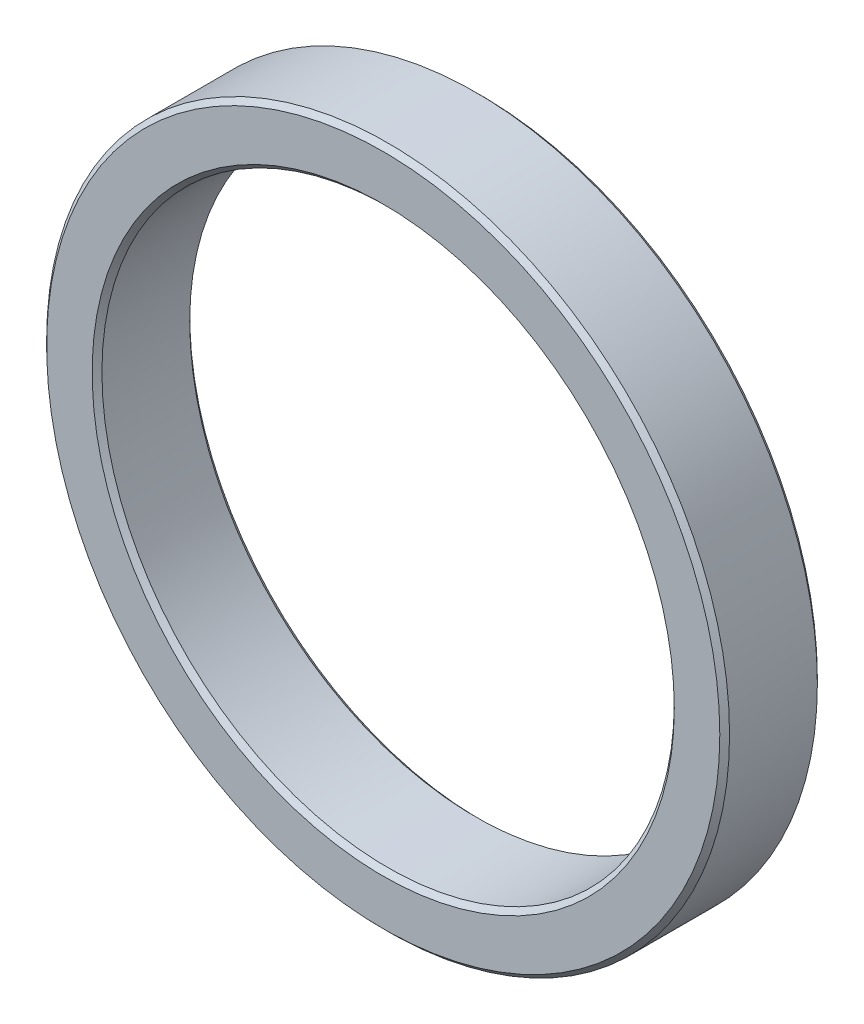
ISO-10303-21;
HEADER;
FILE_DESCRIPTION(('STEP AP214'),'2;1');
FILE_NAME('part.step','',(''),(''),'','','');
FILE_SCHEMA(('AUTOMOTIVE_DESIGN { 1 0 10303 214 1 1 1 1 }'));
ENDSEC;
DATA;
#1=APPLICATION_CONTEXT('core data for automotive mechanical design processes');
#2=APPLICATION_PROTOCOL_DEFINITION('international standard','automotive_design',2000,#1);
#3=PRODUCT_CONTEXT('',#1,'mechanical');
#4=PRODUCT('Part','Part','',(#3));
#5=PRODUCT_RELATED_PRODUCT_CATEGORY('part','',(#4));
#6=PRODUCT_DEFINITION_FORMATION('','',#4);
#7=PRODUCT_DEFINITION_CONTEXT('part definition',#1,'design');
#8=PRODUCT_DEFINITION('design','',#6,#7);
#9=PRODUCT_DEFINITION_SHAPE('','',#8);
#10=(LENGTH_UNIT() NAMED_UNIT(*) SI_UNIT(.MILLI.,.METRE.));
#11=(NAMED_UNIT(*) PLANE_ANGLE_UNIT() SI_UNIT($,.RADIAN.));
#12=(NAMED_UNIT(*) SI_UNIT($,.STERADIAN.) SOLID_ANGLE_UNIT());
#13=UNCERTAINTY_MEASURE_WITH_UNIT(LENGTH_MEASURE(1.E-05),#10,'distance_accuracy_value','');
#14=(GEOMETRIC_REPRESENTATION_CONTEXT(3) GLOBAL_UNCERTAINTY_ASSIGNED_CONTEXT((#13)) GLOBAL_UNIT_ASSIGNED_CONTEXT((#10,
#11,#12)) REPRESENTATION_CONTEXT('',''));
#15=CARTESIAN_POINT('',(0.,0.,0.));
#16=DIRECTION('',(0.,0.,1.));
#17=DIRECTION('',(1.,0.,0.));
#18=AXIS2_PLACEMENT_3D('',#15,#16,#17);
#19=CARTESIAN_POINT('',(0.,0.,6.));
#20=DIRECTION('',(0.,0.,1.));
#21=DIRECTION('',(1.,0.,0.));
#22=AXIS2_PLACEMENT_3D('',#19,#20,#21);
#23=PLANE('',#22);
#24=CARTESIAN_POINT('',(0.,0.,6.));
#25=DIRECTION('',(0.,0.,1.));
#26=DIRECTION('',(1.,0.,0.));
#27=AXIS2_PLACEMENT_3D('',#24,#25,#26);
#28=CIRCLE('',#27,20.7);
#29=CARTESIAN_POINT('',(20.7,0.,6.));
#30=VERTEX_POINT('',#29);
#31=EDGE_CURVE('E39',#30,#30,#28,.T.);
#32=ORIENTED_EDGE('',*,*,#31,.T.);
#33=EDGE_LOOP('',(#32));
#34=FACE_BOUND('',#33,.T.);
#35=CARTESIAN_POINT('',(0.,0.,6.));
#36=DIRECTION('',(0.,0.,1.));
#37=DIRECTION('',(1.,0.,0.));
#38=AXIS2_PLACEMENT_3D('',#35,#36,#37);
#39=CIRCLE('',#38,17.9);
#40=CARTESIAN_POINT('',(17.9,0.,6.));
#41=VERTEX_POINT('',#40);
#42=EDGE_CURVE('E43',#41,#41,#39,.F.);
#43=ORIENTED_EDGE('',*,*,#42,.T.);
#44=EDGE_LOOP('',(#43));
#45=FACE_BOUND('',#44,.T.);
#46=ADVANCED_FACE('F28',(#34,#45),#23,.T.);
#47=CARTESIAN_POINT('',(0.,0.,0.));
#48=DIRECTION('',(0.,0.,1.));
#49=DIRECTION('',(1.,0.,0.));
#50=AXIS2_PLACEMENT_3D('',#47,#48,#49);
#51=PLANE('',#50);
#52=CARTESIAN_POINT('',(0.,0.,0.));
#53=DIRECTION('',(0.,0.,1.));
#54=DIRECTION('',(1.,0.,0.));
#55=AXIS2_PLACEMENT_3D('',#52,#53,#54);
#56=CIRCLE('',#55,20.7);
#57=CARTESIAN_POINT('',(20.7,0.,0.));
#58=VERTEX_POINT('',#57);
#59=EDGE_CURVE('E48',#58,#58,#56,.F.);
#60=ORIENTED_EDGE('',*,*,#59,.T.);
#61=EDGE_LOOP('',(#60));
#62=FACE_BOUND('',#61,.T.);
#63=CARTESIAN_POINT('',(0.,0.,0.));
#64=DIRECTION('',(0.,0.,1.));
#65=DIRECTION('',(1.,0.,0.));
#66=AXIS2_PLACEMENT_3D('',#63,#64,#65);
#67=CIRCLE('',#66,17.9);
#68=CARTESIAN_POINT('',(17.9,0.,0.));
#69=VERTEX_POINT('',#68);
#70=EDGE_CURVE('E51',#69,#69,#67,.T.);
#71=ORIENTED_EDGE('',*,*,#70,.T.);
#72=EDGE_LOOP('',(#71));
#73=FACE_BOUND('',#72,.T.);
#74=ADVANCED_FACE('F73',(#62,#73),#51,.F.);
#75=CARTESIAN_POINT('',(0.,0.,6.));
#76=DIRECTION('',(0.,0.,-1.));
#77=DIRECTION('',(-1.,0.,0.));
#78=AXIS2_PLACEMENT_3D('',#75,#76,#77);
#79=CYLINDRICAL_SURFACE('',#78,21.);
#80=CARTESIAN_POINT('',(0.,0.,0.300000000000005));
#81=DIRECTION('',(0.,0.,1.));
#82=DIRECTION('',(1.,0.,0.));
#83=AXIS2_PLACEMENT_3D('',#80,#81,#82);
#84=CIRCLE('',#83,21.);
#85=CARTESIAN_POINT('',(21.,0.,0.300000000000005));
#86=VERTEX_POINT('',#85);
#87=EDGE_CURVE('E54',#86,#86,#84,.T.);
#88=ORIENTED_EDGE('',*,*,#87,.T.);
#89=EDGE_LOOP('',(#88));
#90=FACE_BOUND('',#89,.T.);
#91=CARTESIAN_POINT('',(0.,0.,5.70000000000001));
#92=DIRECTION('',(0.,0.,1.));
#93=DIRECTION('',(1.,0.,0.));
#94=AXIS2_PLACEMENT_3D('',#91,#92,#93);
#95=CIRCLE('',#94,21.);
#96=CARTESIAN_POINT('',(21.,0.,5.70000000000001));
#97=VERTEX_POINT('',#96);
#98=EDGE_CURVE('E57',#97,#97,#95,.F.);
#99=ORIENTED_EDGE('',*,*,#98,.T.);
#100=EDGE_LOOP('',(#99));
#101=FACE_BOUND('',#100,.T.);
#102=ADVANCED_FACE('F61',(#90,#101),#79,.T.);
#103=CARTESIAN_POINT('',(0.,0.,6.));
#104=DIRECTION('',(0.,0.,-1.));
#105=DIRECTION('',(-1.,0.,0.));
#106=AXIS2_PLACEMENT_3D('',#103,#104,#105);
#107=CYLINDRICAL_SURFACE('',#106,17.6);
#108=CARTESIAN_POINT('',(0.,0.,0.299999999999995));
#109=DIRECTION('',(0.,0.,1.));
#110=DIRECTION('',(1.,0.,0.));
#111=AXIS2_PLACEMENT_3D('',#108,#109,#110);
#112=CIRCLE('',#111,17.6);
#113=CARTESIAN_POINT('',(17.6,0.,0.299999999999995));
#114=VERTEX_POINT('',#113);
#115=EDGE_CURVE('E10',#114,#114,#112,.F.);
#116=ORIENTED_EDGE('',*,*,#115,.T.);
#117=EDGE_LOOP('',(#116));
#118=FACE_BOUND('',#117,.T.);
#119=CARTESIAN_POINT('',(0.,0.,5.7));
#120=DIRECTION('',(0.,0.,1.));
#121=DIRECTION('',(1.,0.,0.));
#122=AXIS2_PLACEMENT_3D('',#119,#120,#121);
#123=CIRCLE('',#122,17.6);
#124=CARTESIAN_POINT('',(17.6,0.,5.7));
#125=VERTEX_POINT('',#124);
#126=EDGE_CURVE('E35',#125,#125,#123,.T.);
#127=ORIENTED_EDGE('',*,*,#126,.T.);
#128=EDGE_LOOP('',(#127));
#129=FACE_BOUND('',#128,.T.);
#130=ADVANCED_FACE('F89',(#118,#129),#107,.F.);
#131=CARTESIAN_POINT('',(0.,0.,0.300000000000005));
#132=DIRECTION('',(0.,0.,1.));
#133=DIRECTION('',(1.,0.,0.));
#134=AXIS2_PLACEMENT_3D('',#131,#132,#133);
#135=CONICAL_SURFACE('',#134,21.,0.785398163397454);
#136=CARTESIAN_POINT('',(20.7,0.,0.));
#137=CARTESIAN_POINT('',(20.703125,0.,0.00312500000000081));
#138=CARTESIAN_POINT('',(20.70625,0.,0.0062500000000006));
#139=CARTESIAN_POINT('',(20.7125,0.,0.0125000000000002));
#140=CARTESIAN_POINT('',(20.715625,0.,0.015625));
#141=CARTESIAN_POINT('',(20.721875,0.,0.021875));
#142=CARTESIAN_POINT('',(20.725,0.,0.0250000000000002));
#143=CARTESIAN_POINT('',(20.73125,0.,0.0312500000000007));
#144=CARTESIAN_POINT('',(20.734375,0.,0.034375000000001));
#145=CARTESIAN_POINT('',(20.740625,0.,0.0406250000000008));
#146=CARTESIAN_POINT('',(20.74375,0.,0.0437500000000004));
#147=CARTESIAN_POINT('',(20.75,0.,0.0500000000000005));
#148=CARTESIAN_POINT('',(20.753125,0.,0.0531250000000011));
#149=CARTESIAN_POINT('',(20.759375,0.,0.0593750000000013));
#150=CARTESIAN_POINT('',(20.7625,0.,0.0625000000000009));
#151=CARTESIAN_POINT('',(20.76875,0.,0.0687500000000007));
#152=CARTESIAN_POINT('',(20.771875,0.,0.071875000000001));
#153=CARTESIAN_POINT('',(20.778125,0.,0.0781250000000015));
#154=CARTESIAN_POINT('',(20.78125,0.,0.0812500000000017));
#155=CARTESIAN_POINT('',(20.7875,0.,0.0875000000000016));
#156=CARTESIAN_POINT('',(20.790625,0.,0.0906250000000013));
#157=CARTESIAN_POINT('',(20.796875,0.,0.0968750000000012));
#158=CARTESIAN_POINT('',(20.8,0.,0.100000000000001));
#159=CARTESIAN_POINT('',(20.80625,0.,0.106250000000002));
#160=CARTESIAN_POINT('',(20.809375,0.,0.109375000000002));
#161=CARTESIAN_POINT('',(20.815625,0.,0.115625000000002));
#162=CARTESIAN_POINT('',(20.81875,0.,0.118750000000002));
#163=CARTESIAN_POINT('',(20.825,0.,0.125000000000002));
#164=CARTESIAN_POINT('',(20.828125,0.,0.128125000000002));
#165=CARTESIAN_POINT('',(20.834375,0.,0.134375000000003));
#166=CARTESIAN_POINT('',(20.8375,0.,0.137500000000002));
#167=CARTESIAN_POINT('',(20.84375,0.,0.143750000000002));
#168=CARTESIAN_POINT('',(20.846875,0.,0.146875000000002));
#169=CARTESIAN_POINT('',(20.853125,0.,0.153125000000003));
#170=CARTESIAN_POINT('',(20.85625,0.,0.156250000000003));
#171=CARTESIAN_POINT('',(20.8625,0.,0.162500000000003));
#172=CARTESIAN_POINT('',(20.865625,0.,0.165625000000003));
#173=CARTESIAN_POINT('',(20.871875,0.,0.171875000000002));
#174=CARTESIAN_POINT('',(20.875,0.,0.175000000000003));
#175=CARTESIAN_POINT('',(20.88125,0.,0.181250000000003));
#176=CARTESIAN_POINT('',(20.884375,0.,0.184375000000004));
#177=CARTESIAN_POINT('',(20.890625,0.,0.190625000000003));
#178=CARTESIAN_POINT('',(20.89375,0.,0.193750000000003));
#179=CARTESIAN_POINT('',(20.9,0.,0.200000000000003));
#180=CARTESIAN_POINT('',(20.903125,0.,0.203125000000004));
#181=CARTESIAN_POINT('',(20.909375,0.,0.209375000000004));
#182=CARTESIAN_POINT('',(20.9125,0.,0.212500000000003));
#183=CARTESIAN_POINT('',(20.91875,0.,0.218750000000003));
#184=CARTESIAN_POINT('',(20.921875,0.,0.221875000000004));
#185=CARTESIAN_POINT('',(20.928125,0.,0.228125000000004));
#186=CARTESIAN_POINT('',(20.93125,0.,0.231250000000004));
#187=CARTESIAN_POINT('',(20.9375,0.,0.237500000000004));
#188=CARTESIAN_POINT('',(20.940625,0.,0.240625000000004));
#189=CARTESIAN_POINT('',(20.946875,0.,0.246875000000004));
#190=CARTESIAN_POINT('',(20.95,0.,0.250000000000004));
#191=CARTESIAN_POINT('',(20.95625,0.,0.256250000000005));
#192=CARTESIAN_POINT('',(20.959375,0.,0.259375000000004));
#193=CARTESIAN_POINT('',(20.965625,0.,0.265625000000004));
#194=CARTESIAN_POINT('',(20.96875,0.,0.268750000000004));
#195=CARTESIAN_POINT('',(20.975,0.,0.275000000000005));
#196=CARTESIAN_POINT('',(20.978125,0.,0.278125000000005));
#197=CARTESIAN_POINT('',(20.984375,0.,0.284375000000005));
#198=CARTESIAN_POINT('',(20.9875,0.,0.287500000000005));
#199=CARTESIAN_POINT('',(20.99375,0.,0.293750000000004));
#200=CARTESIAN_POINT('',(20.996875,0.,0.296875000000004));
#201=CARTESIAN_POINT('',(21.,0.,0.300000000000005));
#202=B_SPLINE_CURVE_WITH_KNOTS('',3,(#136,#137,#138,#139,#140,#141,#142,#143,#144,#145,#146,
#147,#148,#149,#150,#151,#152,#153,#154,#155,#156,#157,#158,#159,#160,#161,#162,#163,#164,#165,
#166,#167,#168,#169,#170,#171,#172,#173,#174,#175,#176,#177,#178,#179,#180,#181,#182,#183,#184,
#185,#186,#187,#188,#189,#190,#191,#192,#193,#194,#195,#196,#197,#198,#199,#200,#201),
.UNSPECIFIED.,.F.,.F.,(4,2,2,2,2,2,2,2,2,2,2,2,2,2,2,2,2,2,2,2,2,2,2,2,2,2,2,2,2,2,2,2,4),(0.,
0.0132582521472471,0.0265165042944967,0.0397747564417439,0.053033008588991,0.0662912607362407,
0.0795495128834878,0.0928077650307374,0.106066017177985,0.119324269325232,0.132582521472481,
0.145840773619728,0.159099025766976,0.172357277914225,0.185615530061472,0.198873782208722,
0.212132034355969,0.225390286503216,0.238648538650466,0.251906790797713,0.26516504294496,
0.27842329509221,0.291681547239457,0.304939799386707,0.318198051533954,0.331456303681201,
0.34471455582845,0.357972807975698,0.371231060122947,0.384489312270194,0.397747564417441,
0.411005816564691,0.424264068711938),.UNSPECIFIED.);
#203=EDGE_CURVE('BSEAM67',#58,#86,#202,.T.);
#204=ORIENTED_EDGE('',*,*,#59,.F.);
#205=ORIENTED_EDGE('',*,*,#87,.F.);
#206=ORIENTED_EDGE('',*,*,#203,.T.);
#207=ORIENTED_EDGE('',*,*,#203,.F.);
#208=EDGE_LOOP('',(#204,#206,#205,#207));
#209=FACE_BOUND('',#208,.T.);
#210=ADVANCED_FACE('F67',(#209),#135,.T.);
#211=CARTESIAN_POINT('',(0.,0.,6.));
#212=DIRECTION('',(0.,0.,-1.));
#213=DIRECTION('',(-1.,0.,0.));
#214=AXIS2_PLACEMENT_3D('',#211,#212,#213);
#215=CONICAL_SURFACE('',#214,20.7,0.785398163397443);
#216=ORIENTED_EDGE('',*,*,#98,.F.);
#217=EDGE_LOOP('',(#216));
#218=FACE_BOUND('',#217,.T.);
#219=ORIENTED_EDGE('',*,*,#31,.F.);
#220=EDGE_LOOP('',(#219));
#221=FACE_BOUND('',#220,.T.);
#222=ADVANCED_FACE('F63',(#218,#221),#215,.T.);
#223=CARTESIAN_POINT('',(0.,0.,0.));
#224=DIRECTION('',(0.,0.,-1.));
#225=DIRECTION('',(-1.,0.,0.));
#226=AXIS2_PLACEMENT_3D('',#223,#224,#225);
#227=CONICAL_SURFACE('',#226,17.9,0.785398163397448);
#228=ORIENTED_EDGE('',*,*,#115,.F.);
#229=EDGE_LOOP('',(#228));
#230=FACE_BOUND('',#229,.T.);
#231=ORIENTED_EDGE('',*,*,#70,.F.);
#232=EDGE_LOOP('',(#231));
#233=FACE_BOUND('',#232,.T.);
#234=ADVANCED_FACE('F66',(#230,#233),#227,.F.);
#235=CARTESIAN_POINT('',(0.,0.,5.7));
#236=DIRECTION('',(0.,0.,1.));
#237=DIRECTION('',(1.,0.,0.));
#238=AXIS2_PLACEMENT_3D('',#235,#236,#237);
#239=CONICAL_SURFACE('',#238,17.6,0.785398163397454);
#240=ORIENTED_EDGE('',*,*,#42,.F.);
#241=EDGE_LOOP('',(#240));
#242=FACE_BOUND('',#241,.T.);
#243=ORIENTED_EDGE('',*,*,#126,.F.);
#244=EDGE_LOOP('',(#243));
#245=FACE_BOUND('',#244,.T.);
#246=ADVANCED_FACE('F30',(#242,#245),#239,.F.);
#247=CLOSED_SHELL('',(#46,#74,#102,#130,#210,#222,#234,#246));
#248=MANIFOLD_SOLID_BREP('B2',#247);
#249=ADVANCED_BREP_SHAPE_REPRESENTATION('',(#18,#248),#14);
#250=SHAPE_DEFINITION_REPRESENTATION(#9,#249);
ENDSEC;
END-ISO-10303-21;
